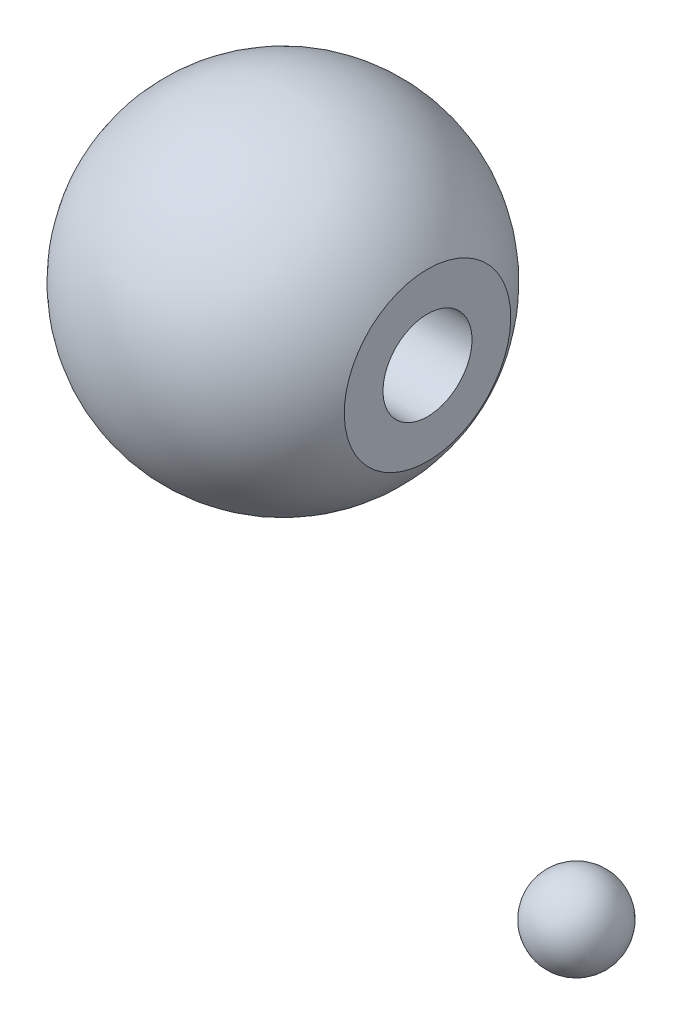
ISO-10303-21;
HEADER;
FILE_DESCRIPTION(('STEP AP214'),'2;1');
FILE_NAME('part.step','',(''),(''),'','','');
FILE_SCHEMA(('AUTOMOTIVE_DESIGN { 1 0 10303 214 1 1 1 1 }'));
ENDSEC;
DATA;
#1=APPLICATION_CONTEXT('core data for automotive mechanical design processes');
#2=APPLICATION_PROTOCOL_DEFINITION('international standard','automotive_design',2000,#1);
#3=PRODUCT_CONTEXT('',#1,'mechanical');
#4=PRODUCT('Part','Part','',(#3));
#5=PRODUCT_RELATED_PRODUCT_CATEGORY('part','',(#4));
#6=PRODUCT_DEFINITION_FORMATION('','',#4);
#7=PRODUCT_DEFINITION_CONTEXT('part definition',#1,'design');
#8=PRODUCT_DEFINITION('design','',#6,#7);
#9=PRODUCT_DEFINITION_SHAPE('','',#8);
#10=(LENGTH_UNIT() NAMED_UNIT(*) SI_UNIT(.MILLI.,.METRE.));
#11=(NAMED_UNIT(*) PLANE_ANGLE_UNIT() SI_UNIT($,.RADIAN.));
#12=(NAMED_UNIT(*) SI_UNIT($,.STERADIAN.) SOLID_ANGLE_UNIT());
#13=UNCERTAINTY_MEASURE_WITH_UNIT(LENGTH_MEASURE(1.E-05),#10,'distance_accuracy_value','');
#14=(GEOMETRIC_REPRESENTATION_CONTEXT(3) GLOBAL_UNCERTAINTY_ASSIGNED_CONTEXT((#13)) GLOBAL_UNIT_ASSIGNED_CONTEXT((#10,
#11,#12)) REPRESENTATION_CONTEXT('',''));
#15=CARTESIAN_POINT('',(0.,0.,0.));
#16=DIRECTION('',(0.,0.,1.));
#17=DIRECTION('',(1.,0.,0.));
#18=AXIS2_PLACEMENT_3D('',#15,#16,#17);
#19=CARTESIAN_POINT('',(94.2447555297576,0.,54.6729932892394));
#20=DIRECTION('',(0.,0.,-1.));
#21=DIRECTION('',(1.,0.,0.));
#22=AXIS2_PLACEMENT_3D('',#19,#20,#21);
#23=SPHERICAL_SURFACE('',#22,5.59999999999999);
#24=CARTESIAN_POINT('',(94.2447555297576,0.,49.0729932892394));
#25=VERTEX_POINT('',#24);
#26=VERTEX_LOOP('',#25);
#27=FACE_BOUND('',#26,.T.);
#28=ADVANCED_FACE('F43',(#27),#23,.T.);
#29=CLOSED_SHELL('',(#28));
#30=MANIFOLD_SOLID_BREP('B2',#29);
#31=CARTESIAN_POINT('',(0.,0.,0.));
#32=DIRECTION('',(1.,0.,0.));
#33=DIRECTION('',(0.,1.,0.));
#34=AXIS2_PLACEMENT_3D('',#31,#32,#33);
#35=SPHERICAL_SURFACE('',#34,22.5);
#36=CARTESIAN_POINT('',(19.5,0.,0.));
#37=DIRECTION('',(1.,0.,0.));
#38=DIRECTION('',(0.,1.,0.));
#39=AXIS2_PLACEMENT_3D('',#36,#37,#38);
#40=CIRCLE('',#39,11.2249721603218);
#41=CARTESIAN_POINT('',(19.5,11.2249721603218,0.));
#42=VERTEX_POINT('',#41);
#43=EDGE_CURVE('E41',#42,#42,#40,.T.);
#44=ORIENTED_EDGE('',*,*,#43,.F.);
#45=EDGE_LOOP('',(#44));
#46=FACE_BOUND('',#45,.T.);
#47=ADVANCED_FACE('F55',(#46),#35,.T.);
#48=CARTESIAN_POINT('',(19.5,0.,0.));
#49=DIRECTION('',(-1.,0.,0.));
#50=DIRECTION('',(0.,-1.,0.));
#51=AXIS2_PLACEMENT_3D('',#48,#49,#50);
#52=PLANE('',#51);
#53=CARTESIAN_POINT('',(19.5,0.,0.));
#54=DIRECTION('',(1.,0.,0.));
#55=DIRECTION('',(0.,0.,-1.));
#56=AXIS2_PLACEMENT_3D('',#53,#54,#55);
#57=CIRCLE('',#56,5.99999999999999);
#58=CARTESIAN_POINT('',(19.5,0.,-5.99999999999999));
#59=VERTEX_POINT('',#58);
#60=EDGE_CURVE('E73',#59,#59,#57,.T.);
#61=ORIENTED_EDGE('',*,*,#60,.F.);
#62=EDGE_LOOP('',(#61));
#63=FACE_BOUND('',#62,.T.);
#64=ORIENTED_EDGE('',*,*,#43,.T.);
#65=EDGE_LOOP('',(#64));
#66=FACE_BOUND('',#65,.T.);
#67=ADVANCED_FACE('F68',(#63,#66),#52,.F.);
#68=CARTESIAN_POINT('',(-14.5,0.,0.));
#69=DIRECTION('',(1.,0.,0.));
#70=DIRECTION('',(0.,0.,-1.));
#71=AXIS2_PLACEMENT_3D('',#68,#69,#70);
#72=CONICAL_SURFACE('',#71,5.99999999999999,1.02974425867665);
#73=CARTESIAN_POINT('',(-18.1051637141654,0.,0.));
#74=VERTEX_POINT('',#73);
#75=VERTEX_LOOP('',#74);
#76=FACE_BOUND('',#75,.T.);
#77=CARTESIAN_POINT('',(-14.5,0.,0.));
#78=DIRECTION('',(1.,0.,0.));
#79=DIRECTION('',(0.,0.,-1.));
#80=AXIS2_PLACEMENT_3D('',#77,#78,#79);
#81=CIRCLE('',#80,5.99999999999999);
#82=CARTESIAN_POINT('',(-14.5,0.,-5.99999999999999));
#83=VERTEX_POINT('',#82);
#84=EDGE_CURVE('E61',#83,#83,#81,.T.);
#85=ORIENTED_EDGE('',*,*,#84,.T.);
#86=EDGE_LOOP('',(#85));
#87=FACE_BOUND('',#86,.T.);
#88=ADVANCED_FACE('F64',(#76,#87),#72,.F.);
#89=CARTESIAN_POINT('',(19.5,0.,0.));
#90=DIRECTION('',(1.,0.,0.));
#91=DIRECTION('',(0.,0.,-1.));
#92=AXIS2_PLACEMENT_3D('',#89,#90,#91);
#93=CYLINDRICAL_SURFACE('',#92,5.99999999999999);
#94=ORIENTED_EDGE('',*,*,#84,.F.);
#95=EDGE_LOOP('',(#94));
#96=FACE_BOUND('',#95,.T.);
#97=ORIENTED_EDGE('',*,*,#60,.T.);
#98=EDGE_LOOP('',(#97));
#99=FACE_BOUND('',#98,.T.);
#100=ADVANCED_FACE('F67',(#96,#99),#93,.F.);
#101=CLOSED_SHELL('',(#47,#67,#88,#100));
#102=MANIFOLD_SOLID_BREP('B6',#101);
#103=ADVANCED_BREP_SHAPE_REPRESENTATION('',(#18,#30,#102),#14);
#104=SHAPE_DEFINITION_REPRESENTATION(#9,#103);
ENDSEC;
END-ISO-10303-21;
